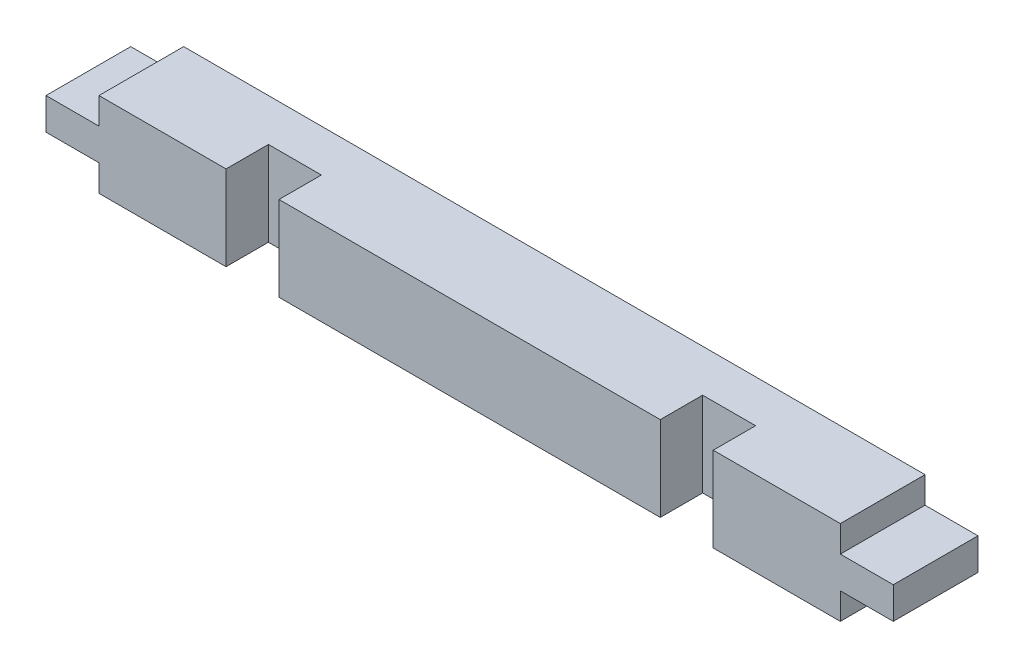
ISO-10303-21;
HEADER;
FILE_DESCRIPTION(('STEP AP214'),'2;1');
FILE_NAME('part.step','',(''),(''),'','','');
FILE_SCHEMA(('AUTOMOTIVE_DESIGN { 1 0 10303 214 1 1 1 1 }'));
ENDSEC;
DATA;
#1=APPLICATION_CONTEXT('core data for automotive mechanical design processes');
#2=APPLICATION_PROTOCOL_DEFINITION('international standard','automotive_design',2000,#1);
#3=PRODUCT_CONTEXT('',#1,'mechanical');
#4=PRODUCT('Part','Part','',(#3));
#5=PRODUCT_RELATED_PRODUCT_CATEGORY('part','',(#4));
#6=PRODUCT_DEFINITION_FORMATION('','',#4);
#7=PRODUCT_DEFINITION_CONTEXT('part definition',#1,'design');
#8=PRODUCT_DEFINITION('design','',#6,#7);
#9=PRODUCT_DEFINITION_SHAPE('','',#8);
#10=(LENGTH_UNIT() NAMED_UNIT(*) SI_UNIT(.MILLI.,.METRE.));
#11=(NAMED_UNIT(*) PLANE_ANGLE_UNIT() SI_UNIT($,.RADIAN.));
#12=(NAMED_UNIT(*) SI_UNIT($,.STERADIAN.) SOLID_ANGLE_UNIT());
#13=UNCERTAINTY_MEASURE_WITH_UNIT(LENGTH_MEASURE(1.E-05),#10,'distance_accuracy_value','');
#14=(GEOMETRIC_REPRESENTATION_CONTEXT(3) GLOBAL_UNCERTAINTY_ASSIGNED_CONTEXT((#13)) GLOBAL_UNIT_ASSIGNED_CONTEXT((#10,
#11,#12)) REPRESENTATION_CONTEXT('',''));
#15=CARTESIAN_POINT('',(0.,0.,0.));
#16=DIRECTION('',(0.,0.,1.));
#17=DIRECTION('',(1.,0.,0.));
#18=AXIS2_PLACEMENT_3D('',#15,#16,#17);
#19=CARTESIAN_POINT('',(0.,0.,8.));
#20=DIRECTION('',(0.,0.,-1.));
#21=DIRECTION('',(-1.,0.,0.));
#22=AXIS2_PLACEMENT_3D('',#19,#20,#21);
#23=PLANE('',#22);
#24=DIRECTION('',(1.,0.,0.));
#25=VECTOR('',#24,1.);
#26=CARTESIAN_POINT('',(75.,-2.5,8.));
#27=LINE('',#26,#25);
#28=CARTESIAN_POINT('',(4.99999999999999,-2.5,8.));
#29=VERTEX_POINT('',#28);
#30=CARTESIAN_POINT('',(17.,-2.5,8.));
#31=VERTEX_POINT('',#30);
#32=EDGE_CURVE('E241',#29,#31,#27,.T.);
#33=ORIENTED_EDGE('',*,*,#32,.T.);
#34=DIRECTION('',(0.,-1.,0.));
#35=VECTOR('',#34,1.);
#36=CARTESIAN_POINT('',(17.,-2.5,8.));
#37=LINE('',#36,#35);
#38=CARTESIAN_POINT('',(17.,5.5,8.));
#39=VERTEX_POINT('',#38);
#40=EDGE_CURVE('E177',#39,#31,#37,.T.);
#41=ORIENTED_EDGE('',*,*,#40,.F.);
#42=DIRECTION('',(-1.,0.,0.));
#43=VECTOR('',#42,1.);
#44=CARTESIAN_POINT('',(4.99999999999999,5.5,8.));
#45=LINE('',#44,#43);
#46=CARTESIAN_POINT('',(4.99999999999999,5.5,8.));
#47=VERTEX_POINT('',#46);
#48=EDGE_CURVE('E254',#39,#47,#45,.T.);
#49=ORIENTED_EDGE('',*,*,#48,.T.);
#50=DIRECTION('',(0.,-1.,0.));
#51=VECTOR('',#50,1.);
#52=CARTESIAN_POINT('',(5.,3.,8.));
#53=LINE('',#52,#51);
#54=CARTESIAN_POINT('',(5.,3.,8.));
#55=VERTEX_POINT('',#54);
#56=EDGE_CURVE('E258',#47,#55,#53,.T.);
#57=ORIENTED_EDGE('',*,*,#56,.T.);
#58=DIRECTION('',(-1.,0.,0.));
#59=VECTOR('',#58,1.);
#60=CARTESIAN_POINT('',(0.,3.,8.));
#61=LINE('',#60,#59);
#62=CARTESIAN_POINT('',(0.,3.,8.));
#63=VERTEX_POINT('',#62);
#64=EDGE_CURVE('E261',#55,#63,#61,.T.);
#65=ORIENTED_EDGE('',*,*,#64,.T.);
#66=DIRECTION('',(0.,-1.,0.));
#67=VECTOR('',#66,1.);
#68=CARTESIAN_POINT('',(0.,0.,8.));
#69=LINE('',#68,#67);
#70=CARTESIAN_POINT('',(0.,0.,8.));
#71=VERTEX_POINT('',#70);
#72=EDGE_CURVE('E263',#63,#71,#69,.T.);
#73=ORIENTED_EDGE('',*,*,#72,.T.);
#74=DIRECTION('',(1.,0.,0.));
#75=VECTOR('',#74,1.);
#76=CARTESIAN_POINT('',(5.,0.,8.));
#77=LINE('',#76,#75);
#78=CARTESIAN_POINT('',(5.,0.,8.));
#79=VERTEX_POINT('',#78);
#80=EDGE_CURVE('E234',#71,#79,#77,.T.);
#81=ORIENTED_EDGE('',*,*,#80,.T.);
#82=DIRECTION('',(0.,-1.,0.));
#83=VECTOR('',#82,1.);
#84=CARTESIAN_POINT('',(4.99999999999999,-2.5,8.));
#85=LINE('',#84,#83);
#86=EDGE_CURVE('E237',#79,#29,#85,.T.);
#87=ORIENTED_EDGE('',*,*,#86,.T.);
#88=EDGE_LOOP('',(#33,#41,#49,#57,#65,#73,#81,#87));
#89=FACE_BOUND('',#88,.T.);
#90=ADVANCED_FACE('F35',(#89),#23,.F.);
#91=CARTESIAN_POINT('',(58.,5.5,8.));
#92=VERTEX_POINT('',#91);
#93=CARTESIAN_POINT('',(22.,5.5,8.));
#94=VERTEX_POINT('',#93);
#95=EDGE_CURVE('E259',#92,#94,#45,.T.);
#96=ORIENTED_EDGE('',*,*,#95,.T.);
#97=DIRECTION('',(0.,1.,0.));
#98=VECTOR('',#97,1.);
#99=CARTESIAN_POINT('',(22.,-2.5,8.));
#100=LINE('',#99,#98);
#101=CARTESIAN_POINT('',(22.,-2.5,8.));
#102=VERTEX_POINT('',#101);
#103=EDGE_CURVE('E191',#102,#94,#100,.T.);
#104=ORIENTED_EDGE('',*,*,#103,.F.);
#105=CARTESIAN_POINT('',(58.,-2.5,8.));
#106=VERTEX_POINT('',#105);
#107=EDGE_CURVE('E244',#102,#106,#27,.T.);
#108=ORIENTED_EDGE('',*,*,#107,.T.);
#109=DIRECTION('',(0.,-1.,0.));
#110=VECTOR('',#109,1.);
#111=CARTESIAN_POINT('',(58.,-2.5,8.));
#112=LINE('',#111,#110);
#113=EDGE_CURVE('E224',#92,#106,#112,.T.);
#114=ORIENTED_EDGE('',*,*,#113,.F.);
#115=EDGE_LOOP('',(#96,#104,#108,#114));
#116=FACE_BOUND('',#115,.T.);
#117=ADVANCED_FACE('F345',(#116),#23,.F.);
#118=CARTESIAN_POINT('',(5.,0.,8.));
#119=DIRECTION('',(0.,1.,0.));
#120=DIRECTION('',(0.,0.,1.));
#121=AXIS2_PLACEMENT_3D('',#118,#119,#120);
#122=PLANE('',#121);
#123=DIRECTION('',(1.,0.,0.));
#124=VECTOR('',#123,1.);
#125=CARTESIAN_POINT('',(5.,0.,0.));
#126=LINE('',#125,#124);
#127=CARTESIAN_POINT('',(0.,0.,0.));
#128=VERTEX_POINT('',#127);
#129=CARTESIAN_POINT('',(5.,0.,0.));
#130=VERTEX_POINT('',#129);
#131=EDGE_CURVE('E205',#128,#130,#126,.T.);
#132=ORIENTED_EDGE('',*,*,#131,.T.);
#133=DIRECTION('',(0.,0.,-1.));
#134=VECTOR('',#133,1.);
#135=CARTESIAN_POINT('',(5.,0.,8.));
#136=LINE('',#135,#134);
#137=EDGE_CURVE('E11',#79,#130,#136,.T.);
#138=ORIENTED_EDGE('',*,*,#137,.F.);
#139=ORIENTED_EDGE('',*,*,#80,.F.);
#140=DIRECTION('',(0.,0.,-1.));
#141=VECTOR('',#140,1.);
#142=CARTESIAN_POINT('',(0.,0.,8.));
#143=LINE('',#142,#141);
#144=EDGE_CURVE('E265',#71,#128,#143,.T.);
#145=ORIENTED_EDGE('',*,*,#144,.T.);
#146=EDGE_LOOP('',(#132,#138,#139,#145));
#147=FACE_BOUND('',#146,.T.);
#148=ADVANCED_FACE('F37',(#147),#122,.F.);
#149=CARTESIAN_POINT('',(4.99999999999999,-2.5,8.));
#150=DIRECTION('',(1.,0.,0.));
#151=DIRECTION('',(0.,1.,0.));
#152=AXIS2_PLACEMENT_3D('',#149,#150,#151);
#153=PLANE('',#152);
#154=DIRECTION('',(0.,-1.,0.));
#155=VECTOR('',#154,1.);
#156=CARTESIAN_POINT('',(4.99999999999999,-2.5,0.));
#157=LINE('',#156,#155);
#158=CARTESIAN_POINT('',(4.99999999999999,-2.5,0.));
#159=VERTEX_POINT('',#158);
#160=EDGE_CURVE('E268',#130,#159,#157,.T.);
#161=ORIENTED_EDGE('',*,*,#160,.T.);
#162=DIRECTION('',(0.,0.,-1.));
#163=VECTOR('',#162,1.);
#164=CARTESIAN_POINT('',(4.99999999999999,-2.5,8.));
#165=LINE('',#164,#163);
#166=EDGE_CURVE('E43',#29,#159,#165,.T.);
#167=ORIENTED_EDGE('',*,*,#166,.F.);
#168=ORIENTED_EDGE('',*,*,#86,.F.);
#169=ORIENTED_EDGE('',*,*,#137,.T.);
#170=EDGE_LOOP('',(#161,#167,#168,#169));
#171=FACE_BOUND('',#170,.T.);
#172=ADVANCED_FACE('F378',(#171),#153,.F.);
#173=CARTESIAN_POINT('',(75.,-2.5,8.));
#174=DIRECTION('',(0.,1.,0.));
#175=DIRECTION('',(0.,0.,1.));
#176=AXIS2_PLACEMENT_3D('',#173,#174,#175);
#177=PLANE('',#176);
#178=DIRECTION('',(1.,0.,0.));
#179=VECTOR('',#178,1.);
#180=CARTESIAN_POINT('',(17.,-2.5,4.));
#181=LINE('',#180,#179);
#182=CARTESIAN_POINT('',(17.,-2.5,4.));
#183=VERTEX_POINT('',#182);
#184=CARTESIAN_POINT('',(22.,-2.5,4.));
#185=VERTEX_POINT('',#184);
#186=EDGE_CURVE('E188',#183,#185,#181,.T.);
#187=ORIENTED_EDGE('',*,*,#186,.F.);
#188=DIRECTION('',(0.,0.,1.));
#189=VECTOR('',#188,1.);
#190=CARTESIAN_POINT('',(17.,-2.5,4.));
#191=LINE('',#190,#189);
#192=EDGE_CURVE('E171',#183,#31,#191,.T.);
#193=ORIENTED_EDGE('',*,*,#192,.T.);
#194=ORIENTED_EDGE('',*,*,#32,.F.);
#195=ORIENTED_EDGE('',*,*,#166,.T.);
#196=DIRECTION('',(1.,0.,0.));
#197=VECTOR('',#196,1.);
#198=CARTESIAN_POINT('',(75.,-2.5,0.));
#199=LINE('',#198,#197);
#200=CARTESIAN_POINT('',(75.,-2.5,0.));
#201=VERTEX_POINT('',#200);
#202=EDGE_CURVE('E270',#159,#201,#199,.T.);
#203=ORIENTED_EDGE('',*,*,#202,.T.);
#204=DIRECTION('',(0.,0.,-1.));
#205=VECTOR('',#204,1.);
#206=CARTESIAN_POINT('',(75.,-2.5,8.));
#207=LINE('',#206,#205);
#208=CARTESIAN_POINT('',(75.,-2.5,8.));
#209=VERTEX_POINT('',#208);
#210=EDGE_CURVE('E315',#209,#201,#207,.T.);
#211=ORIENTED_EDGE('',*,*,#210,.F.);
#212=CARTESIAN_POINT('',(63.,-2.5,8.));
#213=VERTEX_POINT('',#212);
#214=EDGE_CURVE('E240',#213,#209,#27,.T.);
#215=ORIENTED_EDGE('',*,*,#214,.F.);
#216=DIRECTION('',(0.,0.,1.));
#217=VECTOR('',#216,1.);
#218=CARTESIAN_POINT('',(63.,-2.5,4.));
#219=LINE('',#218,#217);
#220=CARTESIAN_POINT('',(63.,-2.5,4.));
#221=VERTEX_POINT('',#220);
#222=EDGE_CURVE('E50',#221,#213,#219,.T.);
#223=ORIENTED_EDGE('',*,*,#222,.F.);
#224=DIRECTION('',(1.,0.,0.));
#225=VECTOR('',#224,1.);
#226=CARTESIAN_POINT('',(58.,-2.5,4.));
#227=LINE('',#226,#225);
#228=CARTESIAN_POINT('',(58.,-2.5,4.));
#229=VERTEX_POINT('',#228);
#230=EDGE_CURVE('E213',#229,#221,#227,.T.);
#231=ORIENTED_EDGE('',*,*,#230,.F.);
#232=DIRECTION('',(0.,0.,1.));
#233=VECTOR('',#232,1.);
#234=CARTESIAN_POINT('',(58.,-2.5,4.));
#235=LINE('',#234,#233);
#236=EDGE_CURVE('E223',#229,#106,#235,.T.);
#237=ORIENTED_EDGE('',*,*,#236,.T.);
#238=ORIENTED_EDGE('',*,*,#107,.F.);
#239=DIRECTION('',(0.,0.,1.));
#240=VECTOR('',#239,1.);
#241=CARTESIAN_POINT('',(22.,-2.5,4.));
#242=LINE('',#241,#240);
#243=EDGE_CURVE('E58',#185,#102,#242,.T.);
#244=ORIENTED_EDGE('',*,*,#243,.F.);
#245=EDGE_LOOP('',(#187,#193,#194,#195,#203,#211,#215,#223,#231,#237,#238,#244));
#246=FACE_BOUND('',#245,.T.);
#247=ADVANCED_FACE('F193',(#246),#177,.F.);
#248=CARTESIAN_POINT('',(75.,0.,8.));
#249=DIRECTION('',(-1.,0.,0.));
#250=DIRECTION('',(0.,0.,1.));
#251=AXIS2_PLACEMENT_3D('',#248,#249,#250);
#252=PLANE('',#251);
#253=DIRECTION('',(0.,1.,0.));
#254=VECTOR('',#253,1.);
#255=CARTESIAN_POINT('',(75.,0.,0.));
#256=LINE('',#255,#254);
#257=CARTESIAN_POINT('',(75.,0.,0.));
#258=VERTEX_POINT('',#257);
#259=EDGE_CURVE('E272',#201,#258,#256,.T.);
#260=ORIENTED_EDGE('',*,*,#259,.T.);
#261=DIRECTION('',(0.,0.,-1.));
#262=VECTOR('',#261,1.);
#263=CARTESIAN_POINT('',(75.,0.,8.));
#264=LINE('',#263,#262);
#265=CARTESIAN_POINT('',(75.,0.,8.));
#266=VERTEX_POINT('',#265);
#267=EDGE_CURVE('E312',#266,#258,#264,.T.);
#268=ORIENTED_EDGE('',*,*,#267,.F.);
#269=DIRECTION('',(0.,1.,0.));
#270=VECTOR('',#269,1.);
#271=CARTESIAN_POINT('',(75.,0.,8.));
#272=LINE('',#271,#270);
#273=EDGE_CURVE('E243',#209,#266,#272,.T.);
#274=ORIENTED_EDGE('',*,*,#273,.F.);
#275=ORIENTED_EDGE('',*,*,#210,.T.);
#276=EDGE_LOOP('',(#260,#268,#274,#275));
#277=FACE_BOUND('',#276,.T.);
#278=ADVANCED_FACE('F330',(#277),#252,.F.);
#279=CARTESIAN_POINT('',(80.,0.,8.));
#280=DIRECTION('',(0.,1.,0.));
#281=DIRECTION('',(0.,0.,1.));
#282=AXIS2_PLACEMENT_3D('',#279,#280,#281);
#283=PLANE('',#282);
#284=DIRECTION('',(1.,0.,0.));
#285=VECTOR('',#284,1.);
#286=CARTESIAN_POINT('',(80.,0.,0.));
#287=LINE('',#286,#285);
#288=CARTESIAN_POINT('',(80.,0.,0.));
#289=VERTEX_POINT('',#288);
#290=EDGE_CURVE('E274',#258,#289,#287,.T.);
#291=ORIENTED_EDGE('',*,*,#290,.T.);
#292=DIRECTION('',(0.,0.,-1.));
#293=VECTOR('',#292,1.);
#294=CARTESIAN_POINT('',(80.,0.,8.));
#295=LINE('',#294,#293);
#296=CARTESIAN_POINT('',(80.,0.,8.));
#297=VERTEX_POINT('',#296);
#298=EDGE_CURVE('E309',#297,#289,#295,.T.);
#299=ORIENTED_EDGE('',*,*,#298,.F.);
#300=DIRECTION('',(1.,0.,0.));
#301=VECTOR('',#300,1.);
#302=CARTESIAN_POINT('',(80.,0.,8.));
#303=LINE('',#302,#301);
#304=EDGE_CURVE('E246',#266,#297,#303,.T.);
#305=ORIENTED_EDGE('',*,*,#304,.F.);
#306=ORIENTED_EDGE('',*,*,#267,.T.);
#307=EDGE_LOOP('',(#291,#299,#305,#306));
#308=FACE_BOUND('',#307,.T.);
#309=ADVANCED_FACE('F334',(#308),#283,.F.);
#310=CARTESIAN_POINT('',(80.,3.,8.));
#311=DIRECTION('',(-1.,0.,0.));
#312=DIRECTION('',(0.,0.,1.));
#313=AXIS2_PLACEMENT_3D('',#310,#311,#312);
#314=PLANE('',#313);
#315=DIRECTION('',(0.,1.,0.));
#316=VECTOR('',#315,1.);
#317=CARTESIAN_POINT('',(80.,3.,0.));
#318=LINE('',#317,#316);
#319=CARTESIAN_POINT('',(80.,3.,0.));
#320=VERTEX_POINT('',#319);
#321=EDGE_CURVE('E276',#289,#320,#318,.T.);
#322=ORIENTED_EDGE('',*,*,#321,.T.);
#323=DIRECTION('',(0.,0.,-1.));
#324=VECTOR('',#323,1.);
#325=CARTESIAN_POINT('',(80.,3.,8.));
#326=LINE('',#325,#324);
#327=CARTESIAN_POINT('',(80.,3.,8.));
#328=VERTEX_POINT('',#327);
#329=EDGE_CURVE('E306',#328,#320,#326,.T.);
#330=ORIENTED_EDGE('',*,*,#329,.F.);
#331=DIRECTION('',(0.,1.,0.));
#332=VECTOR('',#331,1.);
#333=CARTESIAN_POINT('',(80.,3.,8.));
#334=LINE('',#333,#332);
#335=EDGE_CURVE('E248',#297,#328,#334,.T.);
#336=ORIENTED_EDGE('',*,*,#335,.F.);
#337=ORIENTED_EDGE('',*,*,#298,.T.);
#338=EDGE_LOOP('',(#322,#330,#336,#337));
#339=FACE_BOUND('',#338,.T.);
#340=ADVANCED_FACE('F414',(#339),#314,.F.);
#341=CARTESIAN_POINT('',(75.,3.,8.));
#342=DIRECTION('',(0.,-1.,0.));
#343=DIRECTION('',(0.,0.,-1.));
#344=AXIS2_PLACEMENT_3D('',#341,#342,#343);
#345=PLANE('',#344);
#346=DIRECTION('',(-1.,0.,0.));
#347=VECTOR('',#346,1.);
#348=CARTESIAN_POINT('',(75.,3.,0.));
#349=LINE('',#348,#347);
#350=CARTESIAN_POINT('',(75.,3.,0.));
#351=VERTEX_POINT('',#350);
#352=EDGE_CURVE('E278',#320,#351,#349,.T.);
#353=ORIENTED_EDGE('',*,*,#352,.T.);
#354=DIRECTION('',(0.,0.,-1.));
#355=VECTOR('',#354,1.);
#356=CARTESIAN_POINT('',(75.,3.,8.));
#357=LINE('',#356,#355);
#358=CARTESIAN_POINT('',(75.,3.,8.));
#359=VERTEX_POINT('',#358);
#360=EDGE_CURVE('E303',#359,#351,#357,.T.);
#361=ORIENTED_EDGE('',*,*,#360,.F.);
#362=DIRECTION('',(-1.,0.,0.));
#363=VECTOR('',#362,1.);
#364=CARTESIAN_POINT('',(75.,3.,8.));
#365=LINE('',#364,#363);
#366=EDGE_CURVE('E250',#328,#359,#365,.T.);
#367=ORIENTED_EDGE('',*,*,#366,.F.);
#368=ORIENTED_EDGE('',*,*,#329,.T.);
#369=EDGE_LOOP('',(#353,#361,#367,#368));
#370=FACE_BOUND('',#369,.T.);
#371=ADVANCED_FACE('F410',(#370),#345,.F.);
#372=CARTESIAN_POINT('',(75.,5.5,8.));
#373=DIRECTION('',(-1.,0.,0.));
#374=DIRECTION('',(0.,-1.,0.));
#375=AXIS2_PLACEMENT_3D('',#372,#373,#374);
#376=PLANE('',#375);
#377=DIRECTION('',(0.,1.,0.));
#378=VECTOR('',#377,1.);
#379=CARTESIAN_POINT('',(75.,5.5,0.));
#380=LINE('',#379,#378);
#381=CARTESIAN_POINT('',(75.,5.5,0.));
#382=VERTEX_POINT('',#381);
#383=EDGE_CURVE('E280',#351,#382,#380,.T.);
#384=ORIENTED_EDGE('',*,*,#383,.T.);
#385=DIRECTION('',(0.,0.,-1.));
#386=VECTOR('',#385,1.);
#387=CARTESIAN_POINT('',(75.,5.5,8.));
#388=LINE('',#387,#386);
#389=CARTESIAN_POINT('',(75.,5.5,8.));
#390=VERTEX_POINT('',#389);
#391=EDGE_CURVE('E300',#390,#382,#388,.T.);
#392=ORIENTED_EDGE('',*,*,#391,.F.);
#393=DIRECTION('',(0.,1.,0.));
#394=VECTOR('',#393,1.);
#395=CARTESIAN_POINT('',(75.,5.5,8.));
#396=LINE('',#395,#394);
#397=EDGE_CURVE('E252',#359,#390,#396,.T.);
#398=ORIENTED_EDGE('',*,*,#397,.F.);
#399=ORIENTED_EDGE('',*,*,#360,.T.);
#400=EDGE_LOOP('',(#384,#392,#398,#399));
#401=FACE_BOUND('',#400,.T.);
#402=ADVANCED_FACE('F407',(#401),#376,.F.);
#403=CARTESIAN_POINT('',(4.99999999999999,5.5,8.));
#404=DIRECTION('',(0.,-1.,0.));
#405=DIRECTION('',(0.,0.,-1.));
#406=AXIS2_PLACEMENT_3D('',#403,#404,#405);
#407=PLANE('',#406);
#408=ORIENTED_EDGE('',*,*,#48,.F.);
#409=DIRECTION('',(0.,0.,1.));
#410=VECTOR('',#409,1.);
#411=CARTESIAN_POINT('',(17.,5.5,4.));
#412=LINE('',#411,#410);
#413=CARTESIAN_POINT('',(17.,5.5,4.));
#414=VERTEX_POINT('',#413);
#415=EDGE_CURVE('E203',#414,#39,#412,.T.);
#416=ORIENTED_EDGE('',*,*,#415,.F.);
#417=DIRECTION('',(-1.,0.,0.));
#418=VECTOR('',#417,1.);
#419=CARTESIAN_POINT('',(17.,5.5,4.));
#420=LINE('',#419,#418);
#421=CARTESIAN_POINT('',(22.,5.5,4.));
#422=VERTEX_POINT('',#421);
#423=EDGE_CURVE('E182',#422,#414,#420,.T.);
#424=ORIENTED_EDGE('',*,*,#423,.F.);
#425=DIRECTION('',(0.,0.,1.));
#426=VECTOR('',#425,1.);
#427=CARTESIAN_POINT('',(22.,5.5,4.));
#428=LINE('',#427,#426);
#429=EDGE_CURVE('E206',#422,#94,#428,.T.);
#430=ORIENTED_EDGE('',*,*,#429,.T.);
#431=ORIENTED_EDGE('',*,*,#95,.F.);
#432=DIRECTION('',(0.,0.,1.));
#433=VECTOR('',#432,1.);
#434=CARTESIAN_POINT('',(58.,5.5,4.));
#435=LINE('',#434,#433);
#436=CARTESIAN_POINT('',(58.,5.5,4.));
#437=VERTEX_POINT('',#436);
#438=EDGE_CURVE('E201',#437,#92,#435,.T.);
#439=ORIENTED_EDGE('',*,*,#438,.F.);
#440=DIRECTION('',(-1.,0.,0.));
#441=VECTOR('',#440,1.);
#442=CARTESIAN_POINT('',(58.,5.5,4.));
#443=LINE('',#442,#441);
#444=CARTESIAN_POINT('',(63.,5.5,4.));
#445=VERTEX_POINT('',#444);
#446=EDGE_CURVE('E220',#445,#437,#443,.T.);
#447=ORIENTED_EDGE('',*,*,#446,.F.);
#448=DIRECTION('',(0.,0.,1.));
#449=VECTOR('',#448,1.);
#450=CARTESIAN_POINT('',(63.,5.5,4.));
#451=LINE('',#450,#449);
#452=CARTESIAN_POINT('',(63.,5.5,8.));
#453=VERTEX_POINT('',#452);
#454=EDGE_CURVE('E228',#445,#453,#451,.T.);
#455=ORIENTED_EDGE('',*,*,#454,.T.);
#456=EDGE_CURVE('E255',#390,#453,#45,.T.);
#457=ORIENTED_EDGE('',*,*,#456,.F.);
#458=ORIENTED_EDGE('',*,*,#391,.T.);
#459=DIRECTION('',(-1.,0.,0.));
#460=VECTOR('',#459,1.);
#461=CARTESIAN_POINT('',(4.99999999999999,5.5,0.));
#462=LINE('',#461,#460);
#463=CARTESIAN_POINT('',(4.99999999999999,5.5,0.));
#464=VERTEX_POINT('',#463);
#465=EDGE_CURVE('E282',#382,#464,#462,.T.);
#466=ORIENTED_EDGE('',*,*,#465,.T.);
#467=DIRECTION('',(0.,0.,-1.));
#468=VECTOR('',#467,1.);
#469=CARTESIAN_POINT('',(4.99999999999999,5.5,8.));
#470=LINE('',#469,#468);
#471=EDGE_CURVE('E297',#47,#464,#470,.T.);
#472=ORIENTED_EDGE('',*,*,#471,.F.);
#473=EDGE_LOOP('',(#408,#416,#424,#430,#431,#439,#447,#455,#457,#458,#466,#472));
#474=FACE_BOUND('',#473,.T.);
#475=ADVANCED_FACE('F356',(#474),#407,.F.);
#476=CARTESIAN_POINT('',(5.,3.,8.));
#477=DIRECTION('',(1.,0.,0.));
#478=DIRECTION('',(0.,1.,0.));
#479=AXIS2_PLACEMENT_3D('',#476,#477,#478);
#480=PLANE('',#479);
#481=DIRECTION('',(0.,-1.,0.));
#482=VECTOR('',#481,1.);
#483=CARTESIAN_POINT('',(5.,3.,0.));
#484=LINE('',#483,#482);
#485=CARTESIAN_POINT('',(5.,3.,0.));
#486=VERTEX_POINT('',#485);
#487=EDGE_CURVE('E284',#464,#486,#484,.T.);
#488=ORIENTED_EDGE('',*,*,#487,.T.);
#489=DIRECTION('',(0.,0.,-1.));
#490=VECTOR('',#489,1.);
#491=CARTESIAN_POINT('',(5.,3.,8.));
#492=LINE('',#491,#490);
#493=EDGE_CURVE('E294',#55,#486,#492,.T.);
#494=ORIENTED_EDGE('',*,*,#493,.F.);
#495=ORIENTED_EDGE('',*,*,#56,.F.);
#496=ORIENTED_EDGE('',*,*,#471,.T.);
#497=EDGE_LOOP('',(#488,#494,#495,#496));
#498=FACE_BOUND('',#497,.T.);
#499=ADVANCED_FACE('F364',(#498),#480,.F.);
#500=CARTESIAN_POINT('',(0.,3.,8.));
#501=DIRECTION('',(0.,-1.,0.));
#502=DIRECTION('',(0.,0.,-1.));
#503=AXIS2_PLACEMENT_3D('',#500,#501,#502);
#504=PLANE('',#503);
#505=DIRECTION('',(-1.,0.,0.));
#506=VECTOR('',#505,1.);
#507=CARTESIAN_POINT('',(0.,3.,0.));
#508=LINE('',#507,#506);
#509=CARTESIAN_POINT('',(0.,3.,0.));
#510=VERTEX_POINT('',#509);
#511=EDGE_CURVE('E286',#486,#510,#508,.T.);
#512=ORIENTED_EDGE('',*,*,#511,.T.);
#513=DIRECTION('',(0.,0.,-1.));
#514=VECTOR('',#513,1.);
#515=CARTESIAN_POINT('',(0.,3.,8.));
#516=LINE('',#515,#514);
#517=EDGE_CURVE('E291',#63,#510,#516,.T.);
#518=ORIENTED_EDGE('',*,*,#517,.F.);
#519=ORIENTED_EDGE('',*,*,#64,.F.);
#520=ORIENTED_EDGE('',*,*,#493,.T.);
#521=EDGE_LOOP('',(#512,#518,#519,#520));
#522=FACE_BOUND('',#521,.T.);
#523=ADVANCED_FACE('F369',(#522),#504,.F.);
#524=CARTESIAN_POINT('',(0.,0.,8.));
#525=DIRECTION('',(1.,0.,0.));
#526=DIRECTION('',(0.,0.,-1.));
#527=AXIS2_PLACEMENT_3D('',#524,#525,#526);
#528=PLANE('',#527);
#529=DIRECTION('',(0.,-1.,0.));
#530=VECTOR('',#529,1.);
#531=CARTESIAN_POINT('',(0.,0.,0.));
#532=LINE('',#531,#530);
#533=EDGE_CURVE('E238',#510,#128,#532,.T.);
#534=ORIENTED_EDGE('',*,*,#533,.T.);
#535=ORIENTED_EDGE('',*,*,#144,.F.);
#536=ORIENTED_EDGE('',*,*,#72,.F.);
#537=ORIENTED_EDGE('',*,*,#517,.T.);
#538=EDGE_LOOP('',(#534,#535,#536,#537));
#539=FACE_BOUND('',#538,.T.);
#540=ADVANCED_FACE('F375',(#539),#528,.F.);
#541=ORIENTED_EDGE('',*,*,#456,.T.);
#542=DIRECTION('',(0.,1.,0.));
#543=VECTOR('',#542,1.);
#544=CARTESIAN_POINT('',(63.,-2.5,8.));
#545=LINE('',#544,#543);
#546=EDGE_CURVE('E214',#213,#453,#545,.T.);
#547=ORIENTED_EDGE('',*,*,#546,.F.);
#548=ORIENTED_EDGE('',*,*,#214,.T.);
#549=ORIENTED_EDGE('',*,*,#273,.T.);
#550=ORIENTED_EDGE('',*,*,#304,.T.);
#551=ORIENTED_EDGE('',*,*,#335,.T.);
#552=ORIENTED_EDGE('',*,*,#366,.T.);
#553=ORIENTED_EDGE('',*,*,#397,.T.);
#554=EDGE_LOOP('',(#541,#547,#548,#549,#550,#551,#552,#553));
#555=FACE_BOUND('',#554,.T.);
#556=ADVANCED_FACE('F338',(#555),#23,.F.);
#557=CARTESIAN_POINT('',(0.,0.,0.));
#558=DIRECTION('',(0.,0.,-1.));
#559=DIRECTION('',(-1.,0.,0.));
#560=AXIS2_PLACEMENT_3D('',#557,#558,#559);
#561=PLANE('',#560);
#562=ORIENTED_EDGE('',*,*,#131,.F.);
#563=ORIENTED_EDGE('',*,*,#533,.F.);
#564=ORIENTED_EDGE('',*,*,#511,.F.);
#565=ORIENTED_EDGE('',*,*,#487,.F.);
#566=ORIENTED_EDGE('',*,*,#465,.F.);
#567=ORIENTED_EDGE('',*,*,#383,.F.);
#568=ORIENTED_EDGE('',*,*,#352,.F.);
#569=ORIENTED_EDGE('',*,*,#321,.F.);
#570=ORIENTED_EDGE('',*,*,#290,.F.);
#571=ORIENTED_EDGE('',*,*,#259,.F.);
#572=ORIENTED_EDGE('',*,*,#202,.F.);
#573=ORIENTED_EDGE('',*,*,#160,.F.);
#574=EDGE_LOOP('',(#562,#563,#564,#565,#566,#567,#568,#569,#570,#571,#572,#573));
#575=FACE_BOUND('',#574,.T.);
#576=ADVANCED_FACE('F325',(#575),#561,.T.);
#577=CARTESIAN_POINT('',(58.,-2.5,4.));
#578=DIRECTION('',(-1.,0.,0.));
#579=DIRECTION('',(0.,0.,1.));
#580=AXIS2_PLACEMENT_3D('',#577,#578,#579);
#581=PLANE('',#580);
#582=ORIENTED_EDGE('',*,*,#113,.T.);
#583=ORIENTED_EDGE('',*,*,#236,.F.);
#584=DIRECTION('',(0.,-1.,0.));
#585=VECTOR('',#584,1.);
#586=CARTESIAN_POINT('',(58.,-2.5,4.));
#587=LINE('',#586,#585);
#588=EDGE_CURVE('E210',#437,#229,#587,.T.);
#589=ORIENTED_EDGE('',*,*,#588,.F.);
#590=ORIENTED_EDGE('',*,*,#438,.T.);
#591=EDGE_LOOP('',(#582,#583,#589,#590));
#592=FACE_BOUND('',#591,.T.);
#593=ADVANCED_FACE('F349',(#592),#581,.F.);
#594=CARTESIAN_POINT('',(63.,-2.5,4.));
#595=DIRECTION('',(1.,0.,0.));
#596=DIRECTION('',(0.,0.,-1.));
#597=AXIS2_PLACEMENT_3D('',#594,#595,#596);
#598=PLANE('',#597);
#599=ORIENTED_EDGE('',*,*,#546,.T.);
#600=ORIENTED_EDGE('',*,*,#454,.F.);
#601=DIRECTION('',(0.,1.,0.));
#602=VECTOR('',#601,1.);
#603=CARTESIAN_POINT('',(63.,-2.5,4.));
#604=LINE('',#603,#602);
#605=EDGE_CURVE('E217',#221,#445,#604,.T.);
#606=ORIENTED_EDGE('',*,*,#605,.F.);
#607=ORIENTED_EDGE('',*,*,#222,.T.);
#608=EDGE_LOOP('',(#599,#600,#606,#607));
#609=FACE_BOUND('',#608,.T.);
#610=ADVANCED_FACE('F513',(#609),#598,.F.);
#611=CARTESIAN_POINT('',(0.,0.,4.));
#612=DIRECTION('',(0.,0.,-1.));
#613=DIRECTION('',(-1.,0.,0.));
#614=AXIS2_PLACEMENT_3D('',#611,#612,#613);
#615=PLANE('',#614);
#616=ORIENTED_EDGE('',*,*,#588,.T.);
#617=ORIENTED_EDGE('',*,*,#230,.T.);
#618=ORIENTED_EDGE('',*,*,#605,.T.);
#619=ORIENTED_EDGE('',*,*,#446,.T.);
#620=EDGE_LOOP('',(#616,#617,#618,#619));
#621=FACE_BOUND('',#620,.T.);
#622=ADVANCED_FACE('F351',(#621),#615,.F.);
#623=CARTESIAN_POINT('',(17.,-2.5,4.));
#624=DIRECTION('',(-1.,0.,0.));
#625=DIRECTION('',(0.,0.,1.));
#626=AXIS2_PLACEMENT_3D('',#623,#624,#625);
#627=PLANE('',#626);
#628=ORIENTED_EDGE('',*,*,#40,.T.);
#629=ORIENTED_EDGE('',*,*,#192,.F.);
#630=DIRECTION('',(0.,-1.,0.));
#631=VECTOR('',#630,1.);
#632=CARTESIAN_POINT('',(17.,-2.5,4.));
#633=LINE('',#632,#631);
#634=EDGE_CURVE('E174',#414,#183,#633,.T.);
#635=ORIENTED_EDGE('',*,*,#634,.F.);
#636=ORIENTED_EDGE('',*,*,#415,.T.);
#637=EDGE_LOOP('',(#628,#629,#635,#636));
#638=FACE_BOUND('',#637,.T.);
#639=ADVANCED_FACE('F173',(#638),#627,.F.);
#640=CARTESIAN_POINT('',(22.,-2.5,4.));
#641=DIRECTION('',(1.,0.,0.));
#642=DIRECTION('',(0.,0.,-1.));
#643=AXIS2_PLACEMENT_3D('',#640,#641,#642);
#644=PLANE('',#643);
#645=ORIENTED_EDGE('',*,*,#103,.T.);
#646=ORIENTED_EDGE('',*,*,#429,.F.);
#647=DIRECTION('',(0.,1.,0.));
#648=VECTOR('',#647,1.);
#649=CARTESIAN_POINT('',(22.,-2.5,4.));
#650=LINE('',#649,#648);
#651=EDGE_CURVE('E195',#185,#422,#650,.T.);
#652=ORIENTED_EDGE('',*,*,#651,.F.);
#653=ORIENTED_EDGE('',*,*,#243,.T.);
#654=EDGE_LOOP('',(#645,#646,#652,#653));
#655=FACE_BOUND('',#654,.T.);
#656=ADVANCED_FACE('F534',(#655),#644,.F.);
#657=CARTESIAN_POINT('',(0.,0.,4.));
#658=DIRECTION('',(0.,0.,-1.));
#659=DIRECTION('',(-1.,0.,0.));
#660=AXIS2_PLACEMENT_3D('',#657,#658,#659);
#661=PLANE('',#660);
#662=ORIENTED_EDGE('',*,*,#634,.T.);
#663=ORIENTED_EDGE('',*,*,#186,.T.);
#664=ORIENTED_EDGE('',*,*,#651,.T.);
#665=ORIENTED_EDGE('',*,*,#423,.T.);
#666=EDGE_LOOP('',(#662,#663,#664,#665));
#667=FACE_BOUND('',#666,.T.);
#668=ADVANCED_FACE('F186',(#667),#661,.F.);
#669=CLOSED_SHELL('',(#90,#117,#148,#172,#247,#278,#309,#340,#371,#402,#475,#499,#523,#540,#556,
#576,#593,#610,#622,#639,#656,#668));
#670=MANIFOLD_SOLID_BREP('B2',#669);
#671=ADVANCED_BREP_SHAPE_REPRESENTATION('',(#18,#670),#14);
#672=SHAPE_DEFINITION_REPRESENTATION(#9,#671);
ENDSEC;
END-ISO-10303-21;
